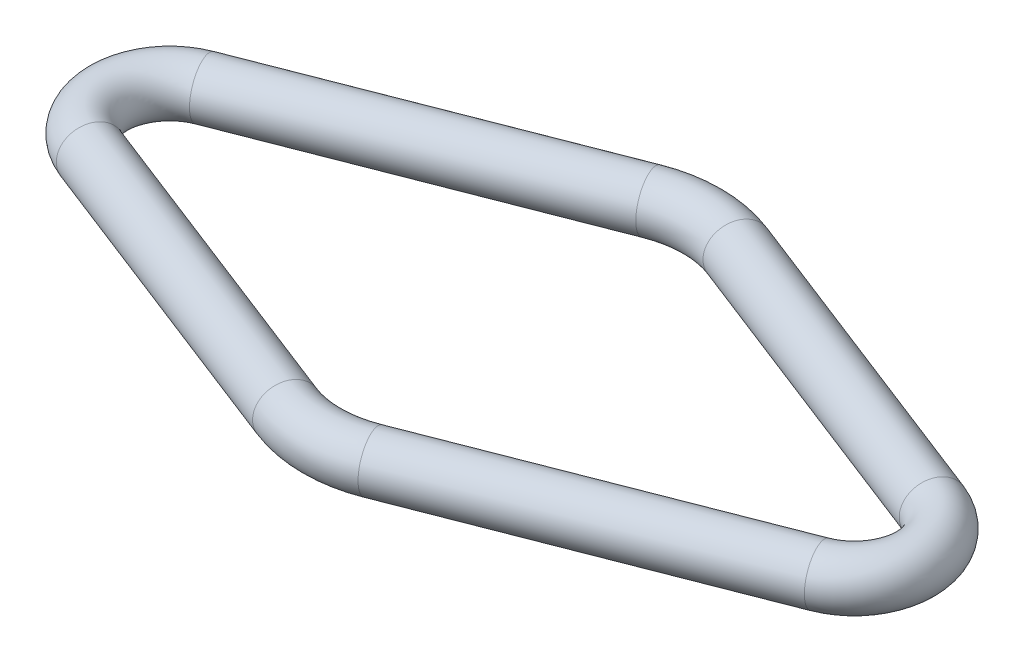
ISO-10303-21;
HEADER;
FILE_DESCRIPTION(('STEP AP214'),'2;1');
FILE_NAME('part.step','',(''),(''),'','','');
FILE_SCHEMA(('AUTOMOTIVE_DESIGN { 1 0 10303 214 1 1 1 1 }'));
ENDSEC;
DATA;
#1=APPLICATION_CONTEXT('core data for automotive mechanical design processes');
#2=APPLICATION_PROTOCOL_DEFINITION('international standard','automotive_design',2000,#1);
#3=PRODUCT_CONTEXT('',#1,'mechanical');
#4=PRODUCT('Part','Part','',(#3));
#5=PRODUCT_RELATED_PRODUCT_CATEGORY('part','',(#4));
#6=PRODUCT_DEFINITION_FORMATION('','',#4);
#7=PRODUCT_DEFINITION_CONTEXT('part definition',#1,'design');
#8=PRODUCT_DEFINITION('design','',#6,#7);
#9=PRODUCT_DEFINITION_SHAPE('','',#8);
#10=(LENGTH_UNIT() NAMED_UNIT(*) SI_UNIT(.MILLI.,.METRE.));
#11=(NAMED_UNIT(*) PLANE_ANGLE_UNIT() SI_UNIT($,.RADIAN.));
#12=(NAMED_UNIT(*) SI_UNIT($,.STERADIAN.) SOLID_ANGLE_UNIT());
#13=UNCERTAINTY_MEASURE_WITH_UNIT(LENGTH_MEASURE(1.E-05),#10,'distance_accuracy_value','');
#14=(GEOMETRIC_REPRESENTATION_CONTEXT(3) GLOBAL_UNCERTAINTY_ASSIGNED_CONTEXT((#13)) GLOBAL_UNIT_ASSIGNED_CONTEXT((#10,
#11,#12)) REPRESENTATION_CONTEXT('',''));
#15=CARTESIAN_POINT('',(0.,0.,0.));
#16=DIRECTION('',(0.,0.,1.));
#17=DIRECTION('',(1.,0.,0.));
#18=AXIS2_PLACEMENT_3D('',#15,#16,#17);
#19=CARTESIAN_POINT('',(-1.30560826918577,0.,5.50490492375474));
#20=DIRECTION('',(-0.931918034376315,0.,-0.362668963662712));
#21=DIRECTION('',(-0.362668963662712,0.,0.931918034376315));
#22=AXIS2_PLACEMENT_3D('',#19,#20,#21);
#23=CYLINDRICAL_SURFACE('',#22,0.8);
#24=CARTESIAN_POINT('',(-11.020937582776,0.,1.72404836359619));
#25=DIRECTION('',(0.931918034376315,0.,0.362668963662712));
#26=DIRECTION('',(0.362668963662712,0.,-0.931918034376315));
#27=AXIS2_PLACEMENT_3D('',#24,#25,#26);
#28=CIRCLE('',#27,0.8);
#29=CARTESIAN_POINT('',(-11.3110727537062,0.,2.46958279109724));
#30=VERTEX_POINT('',#29);
#31=EDGE_CURVE('E57',#30,#30,#28,.T.);
#32=ORIENTED_EDGE('',*,*,#31,.T.);
#33=EDGE_LOOP('',(#32));
#34=FACE_BOUND('',#33,.T.);
#35=CARTESIAN_POINT('',(-1.30560826918577,0.,5.50490492375474));
#36=DIRECTION('',(0.931918034376315,0.,0.362668963662712));
#37=DIRECTION('',(0.362668963662712,0.,-0.931918034376315));
#38=AXIS2_PLACEMENT_3D('',#35,#36,#37);
#39=CIRCLE('',#38,0.8);
#40=CARTESIAN_POINT('',(-1.59574344011594,0.,6.25043935125579));
#41=VERTEX_POINT('',#40);
#42=EDGE_CURVE('E60',#41,#41,#39,.T.);
#43=ORIENTED_EDGE('',*,*,#42,.F.);
#44=EDGE_LOOP('',(#43));
#45=FACE_BOUND('',#44,.T.);
#46=ADVANCED_FACE('F31',(#34,#45),#23,.T.);
#47=CARTESIAN_POINT('',(-10.35,0.,0.));
#48=DIRECTION('',(0.,-1.,0.));
#49=DIRECTION('',(0.,0.,-1.));
#50=AXIS2_PLACEMENT_3D('',#47,#48,#49);
#51=TOROIDAL_SURFACE('',#50,1.85,0.8);
#52=CARTESIAN_POINT('',(-11.020937582776,0.,-1.72404836359618));
#53=DIRECTION('',(-0.931918034376314,0.,0.362668963662715));
#54=DIRECTION('',(0.362668963662715,0.,0.931918034376314));
#55=AXIS2_PLACEMENT_3D('',#52,#53,#54);
#56=CIRCLE('',#55,0.8);
#57=CARTESIAN_POINT('',(-11.3110727537062,0.,-2.46958279109723));
#58=VERTEX_POINT('',#57);
#59=EDGE_CURVE('E54',#58,#58,#56,.T.);
#60=CARTESIAN_POINT('',(-10.35,0.,0.));
#61=DIRECTION('',(0.,-1.,0.));
#62=DIRECTION('',(0.,0.,-1.));
#63=AXIS2_PLACEMENT_3D('',#60,#61,#62);
#64=CIRCLE('',#63,2.65);
#65=EDGE_CURVE('',#30,#58,#64,.T.);
#66=ORIENTED_EDGE('',*,*,#31,.F.);
#67=ORIENTED_EDGE('',*,*,#59,.T.);
#68=ORIENTED_EDGE('',*,*,#65,.T.);
#69=ORIENTED_EDGE('',*,*,#65,.F.);
#70=EDGE_LOOP('',(#66,#68,#67,#69));
#71=FACE_BOUND('',#70,.T.);
#72=ADVANCED_FACE('F67',(#71),#51,.T.);
#73=CARTESIAN_POINT('',(-11.020937582776,0.,-1.72404836359618));
#74=DIRECTION('',(0.931918034376314,0.,-0.362668963662713));
#75=DIRECTION('',(-0.362668963662713,0.,-0.931918034376315));
#76=AXIS2_PLACEMENT_3D('',#73,#74,#75);
#77=CYLINDRICAL_SURFACE('',#76,0.8);
#78=CARTESIAN_POINT('',(-1.30560826918577,0.,-5.50490492375474));
#79=DIRECTION('',(-0.931918034376314,0.,0.362668963662713));
#80=DIRECTION('',(0.362668963662713,0.,0.931918034376314));
#81=AXIS2_PLACEMENT_3D('',#78,#79,#80);
#82=CIRCLE('',#81,0.8);
#83=CARTESIAN_POINT('',(-1.59574344011594,0.,-6.25043935125579));
#84=VERTEX_POINT('',#83);
#85=EDGE_CURVE('E51',#84,#84,#82,.T.);
#86=CARTESIAN_POINT('',(-1.59574344011594,0.,-6.25043935125579));
#87=CARTESIAN_POINT('',(-1.6969447871325,0.,-6.21105542875414));
#88=CARTESIAN_POINT('',(-1.79814613414907,0.,-6.17167150625249));
#89=CARTESIAN_POINT('',(-2.0005488281822,0.,-6.09290366124918));
#90=CARTESIAN_POINT('',(-2.10175017519877,0.,-6.05351973874753));
#91=CARTESIAN_POINT('',(-2.3041528692319,0.,-5.97475189374423));
#92=CARTESIAN_POINT('',(-2.40535421624846,0.,-5.93536797124258));
#93=CARTESIAN_POINT('',(-2.60775691028159,0.,-5.85660012623927));
#94=CARTESIAN_POINT('',(-2.70895825729816,0.,-5.81721620373762));
#95=CARTESIAN_POINT('',(-2.91136095133129,0.,-5.73844835873432));
#96=CARTESIAN_POINT('',(-3.01256229834785,0.,-5.69906443623267));
#97=CARTESIAN_POINT('',(-3.21496499238098,0.,-5.62029659122936));
#98=CARTESIAN_POINT('',(-3.31616633939755,0.,-5.58091266872771));
#99=CARTESIAN_POINT('',(-3.51856903343068,0.,-5.50214482372441));
#100=CARTESIAN_POINT('',(-3.61977038044724,0.,-5.46276090122276));
#101=CARTESIAN_POINT('',(-3.82217307448037,0.,-5.38399305621945));
#102=CARTESIAN_POINT('',(-3.92337442149694,0.,-5.3446091337178));
#103=CARTESIAN_POINT('',(-4.12577711553007,0.,-5.2658412887145));
#104=CARTESIAN_POINT('',(-4.22697846254663,0.,-5.22645736621285));
#105=CARTESIAN_POINT('',(-4.42938115657977,0.,-5.14768952120954));
#106=CARTESIAN_POINT('',(-4.53058250359633,0.,-5.10830559870789));
#107=CARTESIAN_POINT('',(-4.73298519762946,0.,-5.02953775370459));
#108=CARTESIAN_POINT('',(-4.83418654464603,0.,-4.99015383120294));
#109=CARTESIAN_POINT('',(-5.03658923867916,0.,-4.91138598619963));
#110=CARTESIAN_POINT('',(-5.13779058569572,0.,-4.87200206369798));
#111=CARTESIAN_POINT('',(-5.34019327972885,0.,-4.79323421869468));
#112=CARTESIAN_POINT('',(-5.44139462674542,0.,-4.75385029619303));
#113=CARTESIAN_POINT('',(-5.64379732077855,0.,-4.67508245118972));
#114=CARTESIAN_POINT('',(-5.74499866779511,0.,-4.63569852868807));
#115=CARTESIAN_POINT('',(-5.94740136182824,0.,-4.55693068368477));
#116=CARTESIAN_POINT('',(-6.04860270884481,0.,-4.51754676118312));
#117=CARTESIAN_POINT('',(-6.25100540287794,0.,-4.43877891617981));
#118=CARTESIAN_POINT('',(-6.3522067498945,0.,-4.39939499367816));
#119=CARTESIAN_POINT('',(-6.55460944392763,0.,-4.32062714867486));
#120=CARTESIAN_POINT('',(-6.6558107909442,0.,-4.28124322617321));
#121=CARTESIAN_POINT('',(-6.85821348497733,0.,-4.2024753811699));
#122=CARTESIAN_POINT('',(-6.95941483199389,0.,-4.16309145866825));
#123=CARTESIAN_POINT('',(-7.16181752602702,0.,-4.08432361366495));
#124=CARTESIAN_POINT('',(-7.26301887304359,0.,-4.0449396911633));
#125=CARTESIAN_POINT('',(-7.46542156707672,0.,-3.96617184615999));
#126=CARTESIAN_POINT('',(-7.56662291409329,0.,-3.92678792365834));
#127=CARTESIAN_POINT('',(-7.76902560812642,0.,-3.84802007865504));
#128=CARTESIAN_POINT('',(-7.87022695514298,0.,-3.80863615615339));
#129=CARTESIAN_POINT('',(-8.07262964917611,0.,-3.72986831115008));
#130=CARTESIAN_POINT('',(-8.17383099619268,0.,-3.69048438864843));
#131=CARTESIAN_POINT('',(-8.37623369022581,0.,-3.61171654364513));
#132=CARTESIAN_POINT('',(-8.47743503724237,0.,-3.57233262114348));
#133=CARTESIAN_POINT('',(-8.6798377312755,0.,-3.49356477614017));
#134=CARTESIAN_POINT('',(-8.78103907829207,0.,-3.45418085363852));
#135=CARTESIAN_POINT('',(-8.9834417723252,0.,-3.37541300863522));
#136=CARTESIAN_POINT('',(-9.08464311934176,0.,-3.33602908613357));
#137=CARTESIAN_POINT('',(-9.28704581337489,0.,-3.25726124113026));
#138=CARTESIAN_POINT('',(-9.38824716039146,0.,-3.21787731862861));
#139=CARTESIAN_POINT('',(-9.59064985442459,0.,-3.13910947362531));
#140=CARTESIAN_POINT('',(-9.69185120144116,0.,-3.09972555112366));
#141=CARTESIAN_POINT('',(-9.89425389547429,0.,-3.02095770612035));
#142=CARTESIAN_POINT('',(-9.99545524249085,0.,-2.9815737836187));
#143=CARTESIAN_POINT('',(-10.197857936524,0.,-2.9028059386154));
#144=CARTESIAN_POINT('',(-10.2990592835405,0.,-2.86342201611375));
#145=CARTESIAN_POINT('',(-10.5014619775737,0.,-2.78465417111044));
#146=CARTESIAN_POINT('',(-10.6026633245902,0.,-2.74527024860879));
#147=CARTESIAN_POINT('',(-10.8050660186234,0.,-2.66650240360549));
#148=CARTESIAN_POINT('',(-10.9062673656399,0.,-2.62711848110384));
#149=CARTESIAN_POINT('',(-11.1086700596731,0.,-2.54835063610053));
#150=CARTESIAN_POINT('',(-11.2098714066896,0.,-2.50896671359888));
#151=CARTESIAN_POINT('',(-11.3110727537062,0.,-2.46958279109723));
#152=B_SPLINE_CURVE_WITH_KNOTS('',3,(#86,#87,#88,#89,#90,#91,#92,#93,#94,#95,#96,#97,#98,#99,
#100,#101,#102,#103,#104,#105,#106,#107,#108,#109,#110,#111,#112,#113,#114,#115,#116,#117,#118,
#119,#120,#121,#122,#123,#124,#125,#126,#127,#128,#129,#130,#131,#132,#133,#134,#135,#136,#137,
#138,#139,#140,#141,#142,#143,#144,#145,#146,#147,#148,#149,#150,#151),.UNSPECIFIED.,.F.,.F.,(4,
2,2,2,2,2,2,2,2,2,2,2,2,2,2,2,2,2,2,2,2,2,2,2,2,2,2,2,2,2,2,2,4),(0.,0.325784060239679,
0.651568120479356,0.977352180719034,1.30313624095871,1.62892030119839,1.95470436143807,
2.28048842167775,2.60627248191742,2.9320565421571,3.25784060239678,3.58362466263646,
3.90940872287614,4.23519278311581,4.56097684335549,4.88676090359517,5.21254496383485,
5.53832902407453,5.86411308431421,6.18989714455388,6.51568120479356,6.84146526503324,
7.16724932527292,7.4930333855126,7.81881744575227,8.14460150599195,8.47038556623163,
8.79616962647131,9.12195368671099,9.44773774695067,9.77352180719035,10.09930586743,
10.4250899276697),.UNSPECIFIED.);
#153=EDGE_CURVE('BSEAM73',#84,#58,#152,.T.);
#154=ORIENTED_EDGE('',*,*,#85,.T.);
#155=ORIENTED_EDGE('',*,*,#59,.F.);
#156=ORIENTED_EDGE('',*,*,#153,.T.);
#157=ORIENTED_EDGE('',*,*,#153,.F.);
#158=EDGE_LOOP('',(#154,#156,#155,#157));
#159=FACE_BOUND('',#158,.T.);
#160=ADVANCED_FACE('F73',(#159),#77,.T.);
#161=CARTESIAN_POINT('',(0.,0.,-2.15));
#162=DIRECTION('',(0.,-1.,0.));
#163=DIRECTION('',(0.,0.,-1.));
#164=AXIS2_PLACEMENT_3D('',#161,#162,#163);
#165=TOROIDAL_SURFACE('',#164,3.6,0.8);
#166=CARTESIAN_POINT('',(1.30560826918578,0.,-5.50490492375473));
#167=DIRECTION('',(-0.931918034376314,0.,-0.362668963662714));
#168=DIRECTION('',(-0.362668963662714,0.,0.931918034376314));
#169=AXIS2_PLACEMENT_3D('',#166,#167,#168);
#170=CIRCLE('',#169,0.8);
#171=CARTESIAN_POINT('',(1.59574344011595,0.,-6.25043935125578));
#172=VERTEX_POINT('',#171);
#173=EDGE_CURVE('E46',#172,#172,#170,.T.);
#174=CARTESIAN_POINT('',(0.,0.,-2.15));
#175=DIRECTION('',(0.,-1.,0.));
#176=DIRECTION('',(0.,0.,-1.));
#177=AXIS2_PLACEMENT_3D('',#174,#175,#176);
#178=CIRCLE('',#177,4.4);
#179=EDGE_CURVE('',#84,#172,#178,.T.);
#180=ORIENTED_EDGE('',*,*,#85,.F.);
#181=ORIENTED_EDGE('',*,*,#173,.T.);
#182=ORIENTED_EDGE('',*,*,#179,.T.);
#183=ORIENTED_EDGE('',*,*,#179,.F.);
#184=EDGE_LOOP('',(#180,#182,#181,#183));
#185=FACE_BOUND('',#184,.T.);
#186=ADVANCED_FACE('F79',(#185),#165,.T.);
#187=CARTESIAN_POINT('',(1.30560826918577,0.,-5.50490492375474));
#188=DIRECTION('',(0.931918034376315,0.,0.362668963662713));
#189=DIRECTION('',(0.362668963662713,0.,-0.931918034376315));
#190=AXIS2_PLACEMENT_3D('',#187,#188,#189);
#191=CYLINDRICAL_SURFACE('',#190,0.8);
#192=CARTESIAN_POINT('',(11.020937582776,0.,-1.72404836359618));
#193=DIRECTION('',(-0.931918034376315,0.,-0.362668963662713));
#194=DIRECTION('',(-0.362668963662713,0.,0.931918034376315));
#195=AXIS2_PLACEMENT_3D('',#192,#193,#194);
#196=CIRCLE('',#195,0.8);
#197=CARTESIAN_POINT('',(11.3110727537062,0.,-2.46958279109723));
#198=VERTEX_POINT('',#197);
#199=EDGE_CURVE('E42',#198,#198,#196,.T.);
#200=ORIENTED_EDGE('',*,*,#199,.T.);
#201=EDGE_LOOP('',(#200));
#202=FACE_BOUND('',#201,.T.);
#203=ORIENTED_EDGE('',*,*,#173,.F.);
#204=EDGE_LOOP('',(#203));
#205=FACE_BOUND('',#204,.T.);
#206=ADVANCED_FACE('F83',(#202,#205),#191,.T.);
#207=CARTESIAN_POINT('',(10.35,0.,0.));
#208=DIRECTION('',(0.,-1.,0.));
#209=DIRECTION('',(0.,0.,-1.));
#210=AXIS2_PLACEMENT_3D('',#207,#208,#209);
#211=TOROIDAL_SURFACE('',#210,1.85000000000001,0.8);
#212=CARTESIAN_POINT('',(11.020937582776,0.,1.72404836359619));
#213=DIRECTION('',(0.931918034376313,0.,-0.362668963662717));
#214=DIRECTION('',(-0.362668963662717,0.,-0.931918034376313));
#215=AXIS2_PLACEMENT_3D('',#212,#213,#214);
#216=CIRCLE('',#215,0.8);
#217=CARTESIAN_POINT('',(11.3110727537062,0.,2.46958279109724));
#218=VERTEX_POINT('',#217);
#219=EDGE_CURVE('E38',#218,#218,#216,.T.);
#220=CARTESIAN_POINT('',(10.35,0.,0.));
#221=DIRECTION('',(0.,-1.,0.));
#222=DIRECTION('',(0.,0.,-1.));
#223=AXIS2_PLACEMENT_3D('',#220,#221,#222);
#224=CIRCLE('',#223,2.65000000000001);
#225=EDGE_CURVE('',#198,#218,#224,.T.);
#226=ORIENTED_EDGE('',*,*,#199,.F.);
#227=ORIENTED_EDGE('',*,*,#219,.T.);
#228=ORIENTED_EDGE('',*,*,#225,.T.);
#229=ORIENTED_EDGE('',*,*,#225,.F.);
#230=EDGE_LOOP('',(#226,#228,#227,#229));
#231=FACE_BOUND('',#230,.T.);
#232=ADVANCED_FACE('F87',(#231),#211,.T.);
#233=CARTESIAN_POINT('',(11.020937582776,0.,1.72404836359619));
#234=DIRECTION('',(-0.931918034376315,0.,0.362668963662713));
#235=DIRECTION('',(0.362668963662713,0.,0.931918034376315));
#236=AXIS2_PLACEMENT_3D('',#233,#234,#235);
#237=CYLINDRICAL_SURFACE('',#236,0.8);
#238=CARTESIAN_POINT('',(1.30560826918577,0.,5.50490492375474));
#239=DIRECTION('',(0.931918034376315,0.,-0.362668963662713));
#240=DIRECTION('',(-0.362668963662713,0.,-0.931918034376315));
#241=AXIS2_PLACEMENT_3D('',#238,#239,#240);
#242=CIRCLE('',#241,0.8);
#243=CARTESIAN_POINT('',(1.59574344011594,0.,6.25043935125579));
#244=VERTEX_POINT('',#243);
#245=EDGE_CURVE('E10',#244,#244,#242,.T.);
#246=ORIENTED_EDGE('',*,*,#245,.T.);
#247=EDGE_LOOP('',(#246));
#248=FACE_BOUND('',#247,.T.);
#249=ORIENTED_EDGE('',*,*,#219,.F.);
#250=EDGE_LOOP('',(#249));
#251=FACE_BOUND('',#250,.T.);
#252=ADVANCED_FACE('F90',(#248,#251),#237,.T.);
#253=CARTESIAN_POINT('',(0.,0.,2.15));
#254=DIRECTION('',(0.,-1.,0.));
#255=DIRECTION('',(0.,0.,-1.));
#256=AXIS2_PLACEMENT_3D('',#253,#254,#255);
#257=TOROIDAL_SURFACE('',#256,3.6,0.8);
#258=CARTESIAN_POINT('',(0.,0.,2.15));
#259=DIRECTION('',(0.,-1.,0.));
#260=DIRECTION('',(0.,0.,-1.));
#261=AXIS2_PLACEMENT_3D('',#258,#259,#260);
#262=CIRCLE('',#261,4.4);
#263=EDGE_CURVE('',#244,#41,#262,.T.);
#264=ORIENTED_EDGE('',*,*,#245,.F.);
#265=ORIENTED_EDGE('',*,*,#42,.T.);
#266=ORIENTED_EDGE('',*,*,#263,.T.);
#267=ORIENTED_EDGE('',*,*,#263,.F.);
#268=EDGE_LOOP('',(#264,#266,#265,#267));
#269=FACE_BOUND('',#268,.T.);
#270=ADVANCED_FACE('F33',(#269),#257,.T.);
#271=CLOSED_SHELL('',(#46,#72,#160,#186,#206,#232,#252,#270));
#272=MANIFOLD_SOLID_BREP('B2',#271);
#273=ADVANCED_BREP_SHAPE_REPRESENTATION('',(#18,#272),#14);
#274=SHAPE_DEFINITION_REPRESENTATION(#9,#273);
ENDSEC;
END-ISO-10303-21;
